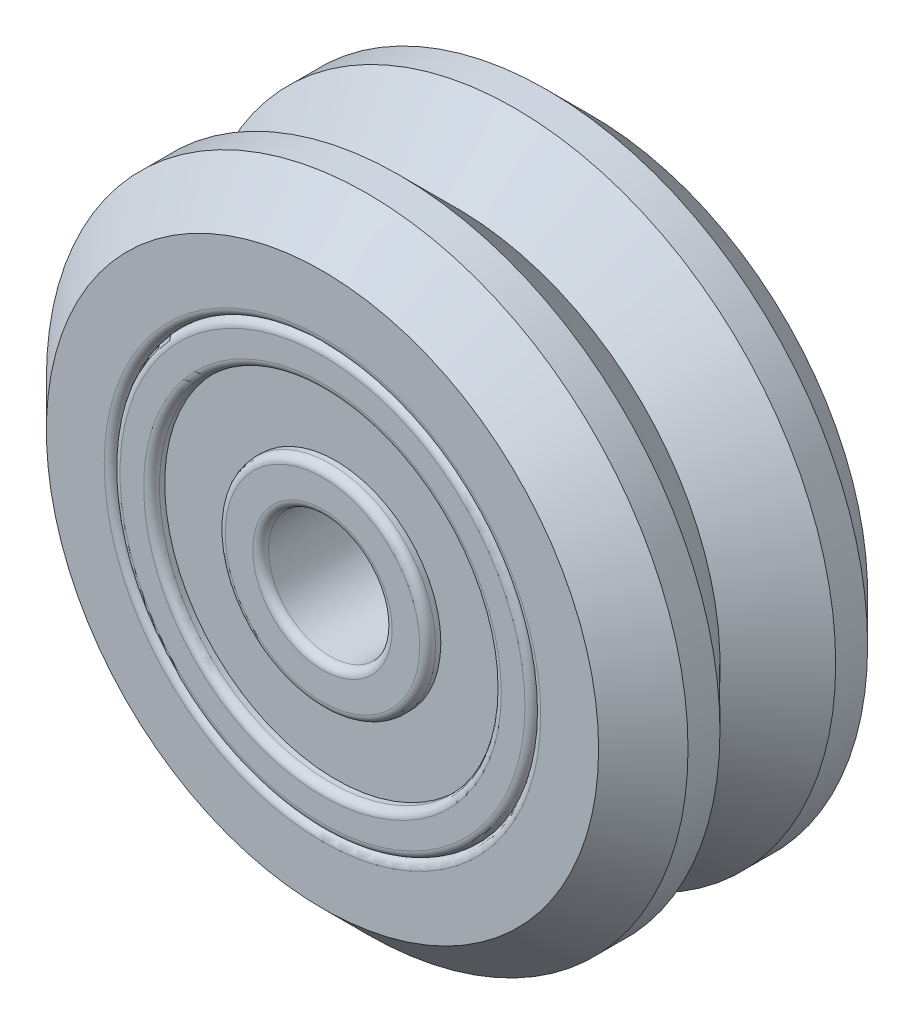
ISO-10303-21;
HEADER;
FILE_DESCRIPTION(('STEP AP214'),'2;1');
FILE_NAME('part.step','',(''),(''),'','','');
FILE_SCHEMA(('AUTOMOTIVE_DESIGN { 1 0 10303 214 1 1 1 1 }'));
ENDSEC;
DATA;
#1=APPLICATION_CONTEXT('core data for automotive mechanical design processes');
#2=APPLICATION_PROTOCOL_DEFINITION('international standard','automotive_design',2000,#1);
#3=PRODUCT_CONTEXT('',#1,'mechanical');
#4=PRODUCT('Part','Part','',(#3));
#5=PRODUCT_RELATED_PRODUCT_CATEGORY('part','',(#4));
#6=PRODUCT_DEFINITION_FORMATION('','',#4);
#7=PRODUCT_DEFINITION_CONTEXT('part definition',#1,'design');
#8=PRODUCT_DEFINITION('design','',#6,#7);
#9=PRODUCT_DEFINITION_SHAPE('','',#8);
#10=(LENGTH_UNIT() NAMED_UNIT(*) SI_UNIT(.MILLI.,.METRE.));
#11=(NAMED_UNIT(*) PLANE_ANGLE_UNIT() SI_UNIT($,.RADIAN.));
#12=(NAMED_UNIT(*) SI_UNIT($,.STERADIAN.) SOLID_ANGLE_UNIT());
#13=UNCERTAINTY_MEASURE_WITH_UNIT(LENGTH_MEASURE(1.E-05),#10,'distance_accuracy_value','');
#14=(GEOMETRIC_REPRESENTATION_CONTEXT(3) GLOBAL_UNCERTAINTY_ASSIGNED_CONTEXT((#13)) GLOBAL_UNIT_ASSIGNED_CONTEXT((#10,
#11,#12)) REPRESENTATION_CONTEXT('',''));
#15=CARTESIAN_POINT('',(0.,0.,0.));
#16=DIRECTION('',(0.,0.,1.));
#17=DIRECTION('',(1.,0.,0.));
#18=AXIS2_PLACEMENT_3D('',#15,#16,#17);
#19=CARTESIAN_POINT('',(0.,0.,0.));
#20=DIRECTION('',(0.,0.,-1.));
#21=DIRECTION('',(1.,0.,0.));
#22=AXIS2_PLACEMENT_3D('',#19,#20,#21);
#23=PLANE('',#22);
#24=CARTESIAN_POINT('',(0.,0.,0.));
#25=DIRECTION('',(0.,0.,1.));
#26=DIRECTION('',(1.,0.,0.));
#27=AXIS2_PLACEMENT_3D('',#24,#25,#26);
#28=CIRCLE('',#27,2.65);
#29=CARTESIAN_POINT('',(2.65,0.,0.));
#30=VERTEX_POINT('',#29);
#31=EDGE_CURVE('E74',#30,#30,#28,.F.);
#32=ORIENTED_EDGE('',*,*,#31,.F.);
#33=EDGE_LOOP('',(#32));
#34=FACE_BOUND('',#33,.T.);
#35=CARTESIAN_POINT('',(0.,0.,0.));
#36=DIRECTION('',(0.,0.,1.));
#37=DIRECTION('',(1.,0.,0.));
#38=AXIS2_PLACEMENT_3D('',#35,#36,#37);
#39=CIRCLE('',#38,3.7);
#40=CARTESIAN_POINT('',(3.7,0.,0.));
#41=VERTEX_POINT('',#40);
#42=EDGE_CURVE('E77',#41,#41,#39,.T.);
#43=ORIENTED_EDGE('',*,*,#42,.F.);
#44=EDGE_LOOP('',(#43));
#45=FACE_BOUND('',#44,.T.);
#46=ADVANCED_FACE('F51',(#34,#45),#23,.T.);
#47=CARTESIAN_POINT('',(0.,0.,4.615));
#48=DIRECTION('',(0.,0.,-1.));
#49=DIRECTION('',(1.,0.,0.));
#50=AXIS2_PLACEMENT_3D('',#47,#48,#49);
#51=CYLINDRICAL_SURFACE('',#50,8.);
#52=CARTESIAN_POINT('',(0.,0.,0.3));
#53=DIRECTION('',(0.,0.,1.));
#54=DIRECTION('',(1.,0.,0.));
#55=AXIS2_PLACEMENT_3D('',#52,#53,#54);
#56=CIRCLE('',#55,8.);
#57=CARTESIAN_POINT('',(8.,0.,0.3));
#58=VERTEX_POINT('',#57);
#59=EDGE_CURVE('E58',#58,#58,#56,.F.);
#60=ORIENTED_EDGE('',*,*,#59,.F.);
#61=EDGE_LOOP('',(#60));
#62=FACE_BOUND('',#61,.T.);
#63=CARTESIAN_POINT('',(0.,0.,4.615));
#64=DIRECTION('',(0.,0.,1.));
#65=DIRECTION('',(1.,0.,0.));
#66=AXIS2_PLACEMENT_3D('',#63,#64,#65);
#67=CIRCLE('',#66,8.);
#68=CARTESIAN_POINT('',(8.,0.,4.615));
#69=VERTEX_POINT('',#68);
#70=EDGE_CURVE('E83',#69,#69,#67,.T.);
#71=ORIENTED_EDGE('',*,*,#70,.F.);
#72=EDGE_LOOP('',(#71));
#73=FACE_BOUND('',#72,.T.);
#74=ADVANCED_FACE('F115',(#62,#73),#51,.T.);
#75=CARTESIAN_POINT('',(0.,0.,4.615));
#76=DIRECTION('',(0.,0.,-1.));
#77=DIRECTION('',(1.,0.,0.));
#78=AXIS2_PLACEMENT_3D('',#75,#76,#77);
#79=PLANE('',#78);
#80=CARTESIAN_POINT('',(0.,0.,4.615));
#81=DIRECTION('',(0.,0.,1.));
#82=DIRECTION('',(1.,0.,0.));
#83=AXIS2_PLACEMENT_3D('',#80,#81,#82);
#84=CIRCLE('',#83,2.35);
#85=CARTESIAN_POINT('',(2.35,0.,4.615));
#86=VERTEX_POINT('',#85);
#87=EDGE_CURVE('E86',#86,#86,#84,.T.);
#88=ORIENTED_EDGE('',*,*,#87,.F.);
#89=EDGE_LOOP('',(#88));
#90=FACE_BOUND('',#89,.T.);
#91=ORIENTED_EDGE('',*,*,#70,.T.);
#92=EDGE_LOOP('',(#91));
#93=FACE_BOUND('',#92,.T.);
#94=ADVANCED_FACE('F122',(#90,#93),#79,.F.);
#95=CARTESIAN_POINT('',(0.,0.,0.));
#96=DIRECTION('',(0.,0.,1.));
#97=DIRECTION('',(1.,0.,0.));
#98=AXIS2_PLACEMENT_3D('',#95,#96,#97);
#99=CIRCLE('',#98,7.7);
#100=CARTESIAN_POINT('',(7.7,0.,0.));
#101=VERTEX_POINT('',#100);
#102=EDGE_CURVE('E62',#101,#101,#99,.T.);
#103=ORIENTED_EDGE('',*,*,#102,.F.);
#104=EDGE_LOOP('',(#103));
#105=FACE_BOUND('',#104,.T.);
#106=CARTESIAN_POINT('',(0.,0.,0.));
#107=DIRECTION('',(0.,0.,1.));
#108=DIRECTION('',(1.,0.,0.));
#109=AXIS2_PLACEMENT_3D('',#106,#107,#108);
#110=CIRCLE('',#109,6.8);
#111=CARTESIAN_POINT('',(6.8,0.,0.));
#112=VERTEX_POINT('',#111);
#113=EDGE_CURVE('E66',#112,#112,#110,.F.);
#114=ORIENTED_EDGE('',*,*,#113,.F.);
#115=EDGE_LOOP('',(#114));
#116=FACE_BOUND('',#115,.T.);
#117=ADVANCED_FACE('F118',(#105,#116),#23,.T.);
#118=CARTESIAN_POINT('',(0.,0.,4.615));
#119=DIRECTION('',(0.,0.,-1.));
#120=DIRECTION('',(1.,0.,0.));
#121=AXIS2_PLACEMENT_3D('',#118,#119,#120);
#122=CYLINDRICAL_SURFACE('',#121,2.35);
#123=CARTESIAN_POINT('',(0.,0.,0.3));
#124=DIRECTION('',(0.,0.,1.));
#125=DIRECTION('',(1.,0.,0.));
#126=AXIS2_PLACEMENT_3D('',#123,#124,#125);
#127=CIRCLE('',#126,2.35);
#128=CARTESIAN_POINT('',(2.35,0.,0.3));
#129=VERTEX_POINT('',#128);
#130=EDGE_CURVE('E80',#129,#129,#127,.T.);
#131=ORIENTED_EDGE('',*,*,#130,.F.);
#132=EDGE_LOOP('',(#131));
#133=FACE_BOUND('',#132,.T.);
#134=ORIENTED_EDGE('',*,*,#87,.T.);
#135=EDGE_LOOP('',(#134));
#136=FACE_BOUND('',#135,.T.);
#137=ADVANCED_FACE('F129',(#133,#136),#122,.F.);
#138=CARTESIAN_POINT('',(0.,0.,0.5));
#139=DIRECTION('',(0.,0.,-1.));
#140=DIRECTION('',(1.,0.,0.));
#141=AXIS2_PLACEMENT_3D('',#138,#139,#140);
#142=CYLINDRICAL_SURFACE('',#141,6.5);
#143=CARTESIAN_POINT('',(0.,0.,0.3));
#144=DIRECTION('',(0.,0.,1.));
#145=DIRECTION('',(1.,0.,0.));
#146=AXIS2_PLACEMENT_3D('',#143,#144,#145);
#147=CIRCLE('',#146,6.5);
#148=CARTESIAN_POINT('',(6.5,0.,0.3));
#149=VERTEX_POINT('',#148);
#150=EDGE_CURVE('E12',#149,#149,#147,.T.);
#151=ORIENTED_EDGE('',*,*,#150,.F.);
#152=EDGE_LOOP('',(#151));
#153=FACE_BOUND('',#152,.T.);
#154=CARTESIAN_POINT('',(0.,0.,0.5));
#155=DIRECTION('',(0.,0.,1.));
#156=DIRECTION('',(1.,0.,0.));
#157=AXIS2_PLACEMENT_3D('',#154,#155,#156);
#158=CIRCLE('',#157,6.5);
#159=CARTESIAN_POINT('',(6.5,0.,0.5));
#160=VERTEX_POINT('',#159);
#161=EDGE_CURVE('E89',#160,#160,#158,.T.);
#162=ORIENTED_EDGE('',*,*,#161,.T.);
#163=EDGE_LOOP('',(#162));
#164=FACE_BOUND('',#163,.T.);
#165=ADVANCED_FACE('F111',(#153,#164),#142,.F.);
#166=CARTESIAN_POINT('',(0.,0.,0.5));
#167=DIRECTION('',(0.,0.,-1.));
#168=DIRECTION('',(1.,0.,0.));
#169=AXIS2_PLACEMENT_3D('',#166,#167,#168);
#170=PLANE('',#169);
#171=CARTESIAN_POINT('',(0.,0.,0.5));
#172=DIRECTION('',(0.,0.,1.));
#173=DIRECTION('',(1.,0.,0.));
#174=AXIS2_PLACEMENT_3D('',#171,#172,#173);
#175=CIRCLE('',#174,4.);
#176=CARTESIAN_POINT('',(4.,0.,0.5));
#177=VERTEX_POINT('',#176);
#178=EDGE_CURVE('E92',#177,#177,#175,.T.);
#179=ORIENTED_EDGE('',*,*,#178,.T.);
#180=EDGE_LOOP('',(#179));
#181=FACE_BOUND('',#180,.T.);
#182=ORIENTED_EDGE('',*,*,#161,.F.);
#183=EDGE_LOOP('',(#182));
#184=FACE_BOUND('',#183,.T.);
#185=ADVANCED_FACE('F96',(#181,#184),#170,.T.);
#186=CARTESIAN_POINT('',(0.,0.,0.5));
#187=DIRECTION('',(0.,0.,-1.));
#188=DIRECTION('',(1.,0.,0.));
#189=AXIS2_PLACEMENT_3D('',#186,#187,#188);
#190=CYLINDRICAL_SURFACE('',#189,4.);
#191=CARTESIAN_POINT('',(0.,0.,0.3));
#192=DIRECTION('',(0.,0.,1.));
#193=DIRECTION('',(1.,0.,0.));
#194=AXIS2_PLACEMENT_3D('',#191,#192,#193);
#195=CIRCLE('',#194,4.);
#196=CARTESIAN_POINT('',(4.,0.,0.3));
#197=VERTEX_POINT('',#196);
#198=EDGE_CURVE('E71',#197,#197,#195,.F.);
#199=ORIENTED_EDGE('',*,*,#198,.F.);
#200=EDGE_LOOP('',(#199));
#201=FACE_BOUND('',#200,.T.);
#202=ORIENTED_EDGE('',*,*,#178,.F.);
#203=EDGE_LOOP('',(#202));
#204=FACE_BOUND('',#203,.T.);
#205=ADVANCED_FACE('F99',(#201,#204),#190,.T.);
#206=CARTESIAN_POINT('',(0.,0.,0.3));
#207=DIRECTION('',(0.,0.,-1.));
#208=DIRECTION('',(1.,0.,0.));
#209=AXIS2_PLACEMENT_3D('',#206,#207,#208);
#210=TOROIDAL_SURFACE('',#209,2.65,0.3);
#211=ORIENTED_EDGE('',*,*,#31,.T.);
#212=EDGE_LOOP('',(#211));
#213=FACE_BOUND('',#212,.T.);
#214=ORIENTED_EDGE('',*,*,#130,.T.);
#215=EDGE_LOOP('',(#214));
#216=FACE_BOUND('',#215,.T.);
#217=ADVANCED_FACE('F101',(#213,#216),#210,.T.);
#218=CARTESIAN_POINT('',(0.,0.,0.3));
#219=DIRECTION('',(0.,0.,-1.));
#220=DIRECTION('',(1.,0.,0.));
#221=AXIS2_PLACEMENT_3D('',#218,#219,#220);
#222=TOROIDAL_SURFACE('',#221,3.7,0.3);
#223=ORIENTED_EDGE('',*,*,#198,.T.);
#224=EDGE_LOOP('',(#223));
#225=FACE_BOUND('',#224,.T.);
#226=ORIENTED_EDGE('',*,*,#42,.T.);
#227=EDGE_LOOP('',(#226));
#228=FACE_BOUND('',#227,.T.);
#229=ADVANCED_FACE('F108',(#225,#228),#222,.T.);
#230=CARTESIAN_POINT('',(0.,0.,0.3));
#231=DIRECTION('',(0.,0.,-1.));
#232=DIRECTION('',(1.,0.,0.));
#233=AXIS2_PLACEMENT_3D('',#230,#231,#232);
#234=TOROIDAL_SURFACE('',#233,7.7,0.3);
#235=ORIENTED_EDGE('',*,*,#59,.T.);
#236=EDGE_LOOP('',(#235));
#237=FACE_BOUND('',#236,.T.);
#238=ORIENTED_EDGE('',*,*,#102,.T.);
#239=EDGE_LOOP('',(#238));
#240=FACE_BOUND('',#239,.T.);
#241=ADVANCED_FACE('F143',(#237,#240),#234,.T.);
#242=CARTESIAN_POINT('',(0.,0.,0.3));
#243=DIRECTION('',(0.,0.,-1.));
#244=DIRECTION('',(1.,0.,0.));
#245=AXIS2_PLACEMENT_3D('',#242,#243,#244);
#246=TOROIDAL_SURFACE('',#245,6.8,0.3);
#247=ORIENTED_EDGE('',*,*,#113,.T.);
#248=EDGE_LOOP('',(#247));
#249=FACE_BOUND('',#248,.T.);
#250=ORIENTED_EDGE('',*,*,#150,.T.);
#251=EDGE_LOOP('',(#250));
#252=FACE_BOUND('',#251,.T.);
#253=ADVANCED_FACE('F53',(#249,#252),#246,.T.);
#254=CLOSED_SHELL('',(#46,#74,#94,#117,#137,#165,#185,#205,#217,#229,#241,#253));
#255=MANIFOLD_SOLID_BREP('B2',#254);
#256=CARTESIAN_POINT('',(0.,0.,10.23));
#257=DIRECTION('',(0.,0.,1.));
#258=DIRECTION('',(1.,0.,0.));
#259=AXIS2_PLACEMENT_3D('',#256,#257,#258);
#260=PLANE('',#259);
#261=CARTESIAN_POINT('',(0.,0.,10.23));
#262=DIRECTION('',(0.,0.,1.));
#263=DIRECTION('',(1.,0.,0.));
#264=AXIS2_PLACEMENT_3D('',#261,#262,#263);
#265=CIRCLE('',#264,2.65);
#266=CARTESIAN_POINT('',(2.65,0.,10.23));
#267=VERTEX_POINT('',#266);
#268=EDGE_CURVE('E286',#267,#267,#265,.F.);
#269=ORIENTED_EDGE('',*,*,#268,.T.);
#270=EDGE_LOOP('',(#269));
#271=FACE_BOUND('',#270,.T.);
#272=CARTESIAN_POINT('',(0.,0.,10.23));
#273=DIRECTION('',(0.,0.,1.));
#274=DIRECTION('',(1.,0.,0.));
#275=AXIS2_PLACEMENT_3D('',#272,#273,#274);
#276=CIRCLE('',#275,3.7);
#277=CARTESIAN_POINT('',(3.7,0.,10.23));
#278=VERTEX_POINT('',#277);
#279=EDGE_CURVE('E289',#278,#278,#276,.T.);
#280=ORIENTED_EDGE('',*,*,#279,.T.);
#281=EDGE_LOOP('',(#280));
#282=FACE_BOUND('',#281,.T.);
#283=ADVANCED_FACE('F263',(#271,#282),#260,.T.);
#284=CARTESIAN_POINT('',(0.,0.,5.615));
#285=DIRECTION('',(0.,0.,1.));
#286=DIRECTION('',(1.,0.,0.));
#287=AXIS2_PLACEMENT_3D('',#284,#285,#286);
#288=CYLINDRICAL_SURFACE('',#287,8.);
#289=CARTESIAN_POINT('',(0.,0.,9.93));
#290=DIRECTION('',(0.,0.,1.));
#291=DIRECTION('',(1.,0.,0.));
#292=AXIS2_PLACEMENT_3D('',#289,#290,#291);
#293=CIRCLE('',#292,8.);
#294=CARTESIAN_POINT('',(8.,0.,9.93));
#295=VERTEX_POINT('',#294);
#296=EDGE_CURVE('E270',#295,#295,#293,.F.);
#297=ORIENTED_EDGE('',*,*,#296,.T.);
#298=EDGE_LOOP('',(#297));
#299=FACE_BOUND('',#298,.T.);
#300=CARTESIAN_POINT('',(0.,0.,5.615));
#301=DIRECTION('',(0.,0.,1.));
#302=DIRECTION('',(1.,0.,0.));
#303=AXIS2_PLACEMENT_3D('',#300,#301,#302);
#304=CIRCLE('',#303,8.);
#305=CARTESIAN_POINT('',(8.,0.,5.615));
#306=VERTEX_POINT('',#305);
#307=EDGE_CURVE('E295',#306,#306,#304,.T.);
#308=ORIENTED_EDGE('',*,*,#307,.T.);
#309=EDGE_LOOP('',(#308));
#310=FACE_BOUND('',#309,.T.);
#311=ADVANCED_FACE('F327',(#299,#310),#288,.T.);
#312=CARTESIAN_POINT('',(0.,0.,5.615));
#313=DIRECTION('',(0.,0.,1.));
#314=DIRECTION('',(1.,0.,0.));
#315=AXIS2_PLACEMENT_3D('',#312,#313,#314);
#316=PLANE('',#315);
#317=CARTESIAN_POINT('',(0.,0.,5.615));
#318=DIRECTION('',(0.,0.,1.));
#319=DIRECTION('',(1.,0.,0.));
#320=AXIS2_PLACEMENT_3D('',#317,#318,#319);
#321=CIRCLE('',#320,2.35);
#322=CARTESIAN_POINT('',(2.35,0.,5.615));
#323=VERTEX_POINT('',#322);
#324=EDGE_CURVE('E298',#323,#323,#321,.T.);
#325=ORIENTED_EDGE('',*,*,#324,.T.);
#326=EDGE_LOOP('',(#325));
#327=FACE_BOUND('',#326,.T.);
#328=ORIENTED_EDGE('',*,*,#307,.F.);
#329=EDGE_LOOP('',(#328));
#330=FACE_BOUND('',#329,.T.);
#331=ADVANCED_FACE('F333',(#327,#330),#316,.F.);
#332=CARTESIAN_POINT('',(0.,0.,10.23));
#333=DIRECTION('',(0.,0.,1.));
#334=DIRECTION('',(1.,0.,0.));
#335=AXIS2_PLACEMENT_3D('',#332,#333,#334);
#336=CIRCLE('',#335,7.7);
#337=CARTESIAN_POINT('',(7.7,0.,10.23));
#338=VERTEX_POINT('',#337);
#339=EDGE_CURVE('E274',#338,#338,#336,.T.);
#340=ORIENTED_EDGE('',*,*,#339,.T.);
#341=EDGE_LOOP('',(#340));
#342=FACE_BOUND('',#341,.T.);
#343=CARTESIAN_POINT('',(0.,0.,10.23));
#344=DIRECTION('',(0.,0.,1.));
#345=DIRECTION('',(1.,0.,0.));
#346=AXIS2_PLACEMENT_3D('',#343,#344,#345);
#347=CIRCLE('',#346,6.8);
#348=CARTESIAN_POINT('',(6.8,0.,10.23));
#349=VERTEX_POINT('',#348);
#350=EDGE_CURVE('E278',#349,#349,#347,.F.);
#351=ORIENTED_EDGE('',*,*,#350,.T.);
#352=EDGE_LOOP('',(#351));
#353=FACE_BOUND('',#352,.T.);
#354=ADVANCED_FACE('F323',(#342,#353),#260,.T.);
#355=CARTESIAN_POINT('',(0.,0.,5.615));
#356=DIRECTION('',(0.,0.,1.));
#357=DIRECTION('',(1.,0.,0.));
#358=AXIS2_PLACEMENT_3D('',#355,#356,#357);
#359=CYLINDRICAL_SURFACE('',#358,2.35);
#360=CARTESIAN_POINT('',(0.,0.,9.93));
#361=DIRECTION('',(0.,0.,1.));
#362=DIRECTION('',(1.,0.,0.));
#363=AXIS2_PLACEMENT_3D('',#360,#361,#362);
#364=CIRCLE('',#363,2.35);
#365=CARTESIAN_POINT('',(2.35,0.,9.93));
#366=VERTEX_POINT('',#365);
#367=EDGE_CURVE('E292',#366,#366,#364,.T.);
#368=ORIENTED_EDGE('',*,*,#367,.T.);
#369=EDGE_LOOP('',(#368));
#370=FACE_BOUND('',#369,.T.);
#371=ORIENTED_EDGE('',*,*,#324,.F.);
#372=EDGE_LOOP('',(#371));
#373=FACE_BOUND('',#372,.T.);
#374=ADVANCED_FACE('F318',(#370,#373),#359,.F.);
#375=CARTESIAN_POINT('',(0.,0.,9.73));
#376=DIRECTION('',(0.,0.,1.));
#377=DIRECTION('',(1.,0.,0.));
#378=AXIS2_PLACEMENT_3D('',#375,#376,#377);
#379=CYLINDRICAL_SURFACE('',#378,6.5);
#380=CARTESIAN_POINT('',(0.,0.,9.93));
#381=DIRECTION('',(0.,0.,1.));
#382=DIRECTION('',(1.,0.,0.));
#383=AXIS2_PLACEMENT_3D('',#380,#381,#382);
#384=CIRCLE('',#383,6.5);
#385=CARTESIAN_POINT('',(6.5,0.,9.93));
#386=VERTEX_POINT('',#385);
#387=EDGE_CURVE('E50',#386,#386,#384,.T.);
#388=ORIENTED_EDGE('',*,*,#387,.T.);
#389=EDGE_LOOP('',(#388));
#390=FACE_BOUND('',#389,.T.);
#391=CARTESIAN_POINT('',(0.,0.,9.73));
#392=DIRECTION('',(0.,0.,1.));
#393=DIRECTION('',(1.,0.,0.));
#394=AXIS2_PLACEMENT_3D('',#391,#392,#393);
#395=CIRCLE('',#394,6.5);
#396=CARTESIAN_POINT('',(6.5,0.,9.73));
#397=VERTEX_POINT('',#396);
#398=EDGE_CURVE('E301',#397,#397,#395,.T.);
#399=ORIENTED_EDGE('',*,*,#398,.F.);
#400=EDGE_LOOP('',(#399));
#401=FACE_BOUND('',#400,.T.);
#402=ADVANCED_FACE('F313',(#390,#401),#379,.F.);
#403=CARTESIAN_POINT('',(0.,0.,9.73));
#404=DIRECTION('',(0.,0.,1.));
#405=DIRECTION('',(1.,0.,0.));
#406=AXIS2_PLACEMENT_3D('',#403,#404,#405);
#407=PLANE('',#406);
#408=CARTESIAN_POINT('',(0.,0.,9.73));
#409=DIRECTION('',(0.,0.,1.));
#410=DIRECTION('',(1.,0.,0.));
#411=AXIS2_PLACEMENT_3D('',#408,#409,#410);
#412=CIRCLE('',#411,4.);
#413=CARTESIAN_POINT('',(4.,0.,9.73));
#414=VERTEX_POINT('',#413);
#415=EDGE_CURVE('E304',#414,#414,#412,.T.);
#416=ORIENTED_EDGE('',*,*,#415,.F.);
#417=EDGE_LOOP('',(#416));
#418=FACE_BOUND('',#417,.T.);
#419=ORIENTED_EDGE('',*,*,#398,.T.);
#420=EDGE_LOOP('',(#419));
#421=FACE_BOUND('',#420,.T.);
#422=ADVANCED_FACE('F310',(#418,#421),#407,.T.);
#423=CARTESIAN_POINT('',(0.,0.,9.73));
#424=DIRECTION('',(0.,0.,1.));
#425=DIRECTION('',(1.,0.,0.));
#426=AXIS2_PLACEMENT_3D('',#423,#424,#425);
#427=CYLINDRICAL_SURFACE('',#426,4.);
#428=CARTESIAN_POINT('',(0.,0.,9.93));
#429=DIRECTION('',(0.,0.,1.));
#430=DIRECTION('',(1.,0.,0.));
#431=AXIS2_PLACEMENT_3D('',#428,#429,#430);
#432=CIRCLE('',#431,4.);
#433=CARTESIAN_POINT('',(4.,0.,9.93));
#434=VERTEX_POINT('',#433);
#435=EDGE_CURVE('E283',#434,#434,#432,.F.);
#436=ORIENTED_EDGE('',*,*,#435,.T.);
#437=EDGE_LOOP('',(#436));
#438=FACE_BOUND('',#437,.T.);
#439=ORIENTED_EDGE('',*,*,#415,.T.);
#440=EDGE_LOOP('',(#439));
#441=FACE_BOUND('',#440,.T.);
#442=ADVANCED_FACE('F308',(#438,#441),#427,.T.);
#443=CARTESIAN_POINT('',(0.,0.,9.93));
#444=DIRECTION('',(0.,0.,1.));
#445=DIRECTION('',(1.,0.,0.));
#446=AXIS2_PLACEMENT_3D('',#443,#444,#445);
#447=TOROIDAL_SURFACE('',#446,2.65,0.3);
#448=ORIENTED_EDGE('',*,*,#268,.F.);
#449=EDGE_LOOP('',(#448));
#450=FACE_BOUND('',#449,.T.);
#451=ORIENTED_EDGE('',*,*,#367,.F.);
#452=EDGE_LOOP('',(#451));
#453=FACE_BOUND('',#452,.T.);
#454=ADVANCED_FACE('F358',(#450,#453),#447,.T.);
#455=CARTESIAN_POINT('',(0.,0.,9.93));
#456=DIRECTION('',(0.,0.,1.));
#457=DIRECTION('',(1.,0.,0.));
#458=AXIS2_PLACEMENT_3D('',#455,#456,#457);
#459=TOROIDAL_SURFACE('',#458,3.7,0.3);
#460=ORIENTED_EDGE('',*,*,#435,.F.);
#461=EDGE_LOOP('',(#460));
#462=FACE_BOUND('',#461,.T.);
#463=ORIENTED_EDGE('',*,*,#279,.F.);
#464=EDGE_LOOP('',(#463));
#465=FACE_BOUND('',#464,.T.);
#466=ADVANCED_FACE('F353',(#462,#465),#459,.T.);
#467=CARTESIAN_POINT('',(0.,0.,9.93));
#468=DIRECTION('',(0.,0.,1.));
#469=DIRECTION('',(1.,0.,0.));
#470=AXIS2_PLACEMENT_3D('',#467,#468,#469);
#471=TOROIDAL_SURFACE('',#470,7.7,0.3);
#472=ORIENTED_EDGE('',*,*,#296,.F.);
#473=EDGE_LOOP('',(#472));
#474=FACE_BOUND('',#473,.T.);
#475=ORIENTED_EDGE('',*,*,#339,.F.);
#476=EDGE_LOOP('',(#475));
#477=FACE_BOUND('',#476,.T.);
#478=ADVANCED_FACE('F349',(#474,#477),#471,.T.);
#479=CARTESIAN_POINT('',(0.,0.,9.93));
#480=DIRECTION('',(0.,0.,1.));
#481=DIRECTION('',(1.,0.,0.));
#482=AXIS2_PLACEMENT_3D('',#479,#480,#481);
#483=TOROIDAL_SURFACE('',#482,6.8,0.3);
#484=ORIENTED_EDGE('',*,*,#350,.F.);
#485=EDGE_LOOP('',(#484));
#486=FACE_BOUND('',#485,.T.);
#487=ORIENTED_EDGE('',*,*,#387,.F.);
#488=EDGE_LOOP('',(#487));
#489=FACE_BOUND('',#488,.T.);
#490=ADVANCED_FACE('F265',(#486,#489),#483,.T.);
#491=CLOSED_SHELL('',(#283,#311,#331,#354,#374,#402,#422,#442,#454,#466,#478,#490));
#492=MANIFOLD_SOLID_BREP('B7',#491);
#493=CARTESIAN_POINT('',(0.,0.,10.23));
#494=DIRECTION('',(0.,0.,-1.));
#495=DIRECTION('',(-1.,0.,0.));
#496=AXIS2_PLACEMENT_3D('',#493,#494,#495);
#497=CYLINDRICAL_SURFACE('',#496,12.2);
#498=CARTESIAN_POINT('',(0.,0.,8.53000000000001));
#499=DIRECTION('',(0.,0.,-1.));
#500=DIRECTION('',(-1.,0.,0.));
#501=AXIS2_PLACEMENT_3D('',#498,#499,#500);
#502=CIRCLE('',#501,12.2);
#503=CARTESIAN_POINT('',(-12.2,0.,8.53000000000001));
#504=VERTEX_POINT('',#503);
#505=EDGE_CURVE('E482',#504,#504,#502,.F.);
#506=ORIENTED_EDGE('',*,*,#505,.F.);
#507=EDGE_LOOP('',(#506));
#508=FACE_BOUND('',#507,.T.);
#509=CARTESIAN_POINT('',(0.,0.,7.31499999999999));
#510=DIRECTION('',(0.,0.,1.));
#511=DIRECTION('',(1.,0.,0.));
#512=AXIS2_PLACEMENT_3D('',#509,#510,#511);
#513=CIRCLE('',#512,12.2);
#514=CARTESIAN_POINT('',(12.2,0.,7.31499999999999));
#515=VERTEX_POINT('',#514);
#516=EDGE_CURVE('E483',#515,#515,#513,.F.);
#517=ORIENTED_EDGE('',*,*,#516,.F.);
#518=EDGE_LOOP('',(#517));
#519=FACE_BOUND('',#518,.T.);
#520=ADVANCED_FACE('F462',(#508,#519),#497,.T.);
#521=CARTESIAN_POINT('',(0.,0.,10.23));
#522=DIRECTION('',(0.,0.,-1.));
#523=DIRECTION('',(-1.,0.,0.));
#524=AXIS2_PLACEMENT_3D('',#521,#522,#523);
#525=CYLINDRICAL_SURFACE('',#524,7.);
#526=CARTESIAN_POINT('',(0.,0.,5.615));
#527=DIRECTION('',(0.,0.,1.));
#528=DIRECTION('',(1.,0.,0.));
#529=AXIS2_PLACEMENT_3D('',#526,#527,#528);
#530=CIRCLE('',#529,7.);
#531=CARTESIAN_POINT('',(7.,0.,5.615));
#532=VERTEX_POINT('',#531);
#533=EDGE_CURVE('E495',#532,#532,#530,.T.);
#534=ORIENTED_EDGE('',*,*,#533,.T.);
#535=EDGE_LOOP('',(#534));
#536=FACE_BOUND('',#535,.T.);
#537=CARTESIAN_POINT('',(0.,0.,4.615));
#538=DIRECTION('',(0.,0.,-1.));
#539=DIRECTION('',(-1.,0.,0.));
#540=AXIS2_PLACEMENT_3D('',#537,#538,#539);
#541=CIRCLE('',#540,7.);
#542=CARTESIAN_POINT('',(-7.,0.,4.615));
#543=VERTEX_POINT('',#542);
#544=EDGE_CURVE('E491',#543,#543,#541,.T.);
#545=ORIENTED_EDGE('',*,*,#544,.T.);
#546=EDGE_LOOP('',(#545));
#547=FACE_BOUND('',#546,.T.);
#548=ADVANCED_FACE('F527',(#536,#547),#525,.F.);
#549=CARTESIAN_POINT('',(0.,0.,2.91500000000001));
#550=DIRECTION('',(0.,0.,-1.));
#551=DIRECTION('',(-1.,0.,0.));
#552=AXIS2_PLACEMENT_3D('',#549,#550,#551);
#553=CIRCLE('',#552,12.2);
#554=CARTESIAN_POINT('',(-12.2,0.,2.91500000000001));
#555=VERTEX_POINT('',#554);
#556=EDGE_CURVE('E487',#555,#555,#553,.T.);
#557=ORIENTED_EDGE('',*,*,#556,.T.);
#558=EDGE_LOOP('',(#557));
#559=FACE_BOUND('',#558,.T.);
#560=CARTESIAN_POINT('',(0.,0.,1.69999999999999));
#561=DIRECTION('',(0.,0.,1.));
#562=DIRECTION('',(1.,0.,0.));
#563=AXIS2_PLACEMENT_3D('',#560,#561,#562);
#564=CIRCLE('',#563,12.2);
#565=CARTESIAN_POINT('',(12.2,0.,1.69999999999999));
#566=VERTEX_POINT('',#565);
#567=EDGE_CURVE('E504',#566,#566,#564,.F.);
#568=ORIENTED_EDGE('',*,*,#567,.F.);
#569=EDGE_LOOP('',(#568));
#570=FACE_BOUND('',#569,.T.);
#571=ADVANCED_FACE('F530',(#559,#570),#497,.T.);
#572=CARTESIAN_POINT('',(0.,0.,0.));
#573=DIRECTION('',(0.,0.,1.));
#574=DIRECTION('',(1.,0.,0.));
#575=AXIS2_PLACEMENT_3D('',#572,#573,#574);
#576=PLANE('',#575);
#577=CARTESIAN_POINT('',(0.,0.,0.));
#578=DIRECTION('',(0.,0.,1.));
#579=DIRECTION('',(1.,0.,0.));
#580=AXIS2_PLACEMENT_3D('',#577,#578,#579);
#581=CIRCLE('',#580,8.3);
#582=CARTESIAN_POINT('',(8.3,0.,0.));
#583=VERTEX_POINT('',#582);
#584=EDGE_CURVE('E262',#583,#583,#581,.T.);
#585=ORIENTED_EDGE('',*,*,#584,.T.);
#586=EDGE_LOOP('',(#585));
#587=FACE_BOUND('',#586,.T.);
#588=CARTESIAN_POINT('',(0.,0.,0.));
#589=DIRECTION('',(0.,0.,-1.));
#590=DIRECTION('',(-1.,0.,0.));
#591=AXIS2_PLACEMENT_3D('',#588,#589,#590);
#592=CIRCLE('',#591,10.5);
#593=CARTESIAN_POINT('',(-10.5,0.,0.));
#594=VERTEX_POINT('',#593);
#595=EDGE_CURVE('E498',#594,#594,#592,.T.);
#596=ORIENTED_EDGE('',*,*,#595,.T.);
#597=EDGE_LOOP('',(#596));
#598=FACE_BOUND('',#597,.T.);
#599=ADVANCED_FACE('F539',(#587,#598),#576,.F.);
#600=CARTESIAN_POINT('',(0.,0.,10.23));
#601=DIRECTION('',(0.,0.,1.));
#602=DIRECTION('',(1.,0.,0.));
#603=AXIS2_PLACEMENT_3D('',#600,#601,#602);
#604=PLANE('',#603);
#605=CARTESIAN_POINT('',(0.,0.,10.23));
#606=DIRECTION('',(0.,0.,1.));
#607=DIRECTION('',(1.,0.,0.));
#608=AXIS2_PLACEMENT_3D('',#605,#606,#607);
#609=CIRCLE('',#608,8.3);
#610=CARTESIAN_POINT('',(8.3,0.,10.23));
#611=VERTEX_POINT('',#610);
#612=EDGE_CURVE('E473',#611,#611,#609,.F.);
#613=ORIENTED_EDGE('',*,*,#612,.T.);
#614=EDGE_LOOP('',(#613));
#615=FACE_BOUND('',#614,.T.);
#616=CARTESIAN_POINT('',(0.,0.,10.23));
#617=DIRECTION('',(0.,0.,1.));
#618=DIRECTION('',(1.,0.,0.));
#619=AXIS2_PLACEMENT_3D('',#616,#617,#618);
#620=CIRCLE('',#619,10.5);
#621=CARTESIAN_POINT('',(10.5,0.,10.23));
#622=VERTEX_POINT('',#621);
#623=EDGE_CURVE('E501',#622,#622,#620,.T.);
#624=ORIENTED_EDGE('',*,*,#623,.T.);
#625=EDGE_LOOP('',(#624));
#626=FACE_BOUND('',#625,.T.);
#627=ADVANCED_FACE('F544',(#615,#626),#604,.T.);
#628=CARTESIAN_POINT('',(0.,0.,10.23));
#629=DIRECTION('',(0.,0.,-1.));
#630=DIRECTION('',(1.,0.,0.));
#631=AXIS2_PLACEMENT_3D('',#628,#629,#630);
#632=CONICAL_SURFACE('',#631,10.5,0.78539816339745);
#633=ORIENTED_EDGE('',*,*,#623,.F.);
#634=EDGE_LOOP('',(#633));
#635=FACE_BOUND('',#634,.T.);
#636=ORIENTED_EDGE('',*,*,#505,.T.);
#637=EDGE_LOOP('',(#636));
#638=FACE_BOUND('',#637,.T.);
#639=ADVANCED_FACE('F552',(#635,#638),#632,.T.);
#640=CARTESIAN_POINT('',(0.,0.,0.));
#641=DIRECTION('',(0.,0.,1.));
#642=DIRECTION('',(-1.,0.,0.));
#643=AXIS2_PLACEMENT_3D('',#640,#641,#642);
#644=CONICAL_SURFACE('',#643,10.5,0.78539816339745);
#645=ORIENTED_EDGE('',*,*,#595,.F.);
#646=EDGE_LOOP('',(#645));
#647=FACE_BOUND('',#646,.T.);
#648=ORIENTED_EDGE('',*,*,#567,.T.);
#649=EDGE_LOOP('',(#648));
#650=FACE_BOUND('',#649,.T.);
#651=ADVANCED_FACE('F549',(#647,#650),#644,.T.);
#652=CARTESIAN_POINT('',(0.,0.,5.615));
#653=DIRECTION('',(0.,0.,1.));
#654=DIRECTION('',(1.,0.,0.));
#655=AXIS2_PLACEMENT_3D('',#652,#653,#654);
#656=CYLINDRICAL_SURFACE('',#655,8.);
#657=CARTESIAN_POINT('',(0.,0.,9.93));
#658=DIRECTION('',(0.,0.,1.));
#659=DIRECTION('',(1.,0.,0.));
#660=AXIS2_PLACEMENT_3D('',#657,#658,#659);
#661=CIRCLE('',#660,8.);
#662=CARTESIAN_POINT('',(8.,0.,9.93));
#663=VERTEX_POINT('',#662);
#664=EDGE_CURVE('E477',#663,#663,#661,.T.);
#665=ORIENTED_EDGE('',*,*,#664,.T.);
#666=EDGE_LOOP('',(#665));
#667=FACE_BOUND('',#666,.T.);
#668=CARTESIAN_POINT('',(0.,0.,5.615));
#669=DIRECTION('',(0.,0.,1.));
#670=DIRECTION('',(1.,0.,0.));
#671=AXIS2_PLACEMENT_3D('',#668,#669,#670);
#672=CIRCLE('',#671,8.);
#673=CARTESIAN_POINT('',(8.,0.,5.615));
#674=VERTEX_POINT('',#673);
#675=EDGE_CURVE('E494',#674,#674,#672,.T.);
#676=ORIENTED_EDGE('',*,*,#675,.F.);
#677=EDGE_LOOP('',(#676));
#678=FACE_BOUND('',#677,.T.);
#679=ADVANCED_FACE('F551',(#667,#678),#656,.F.);
#680=CARTESIAN_POINT('',(0.,0.,5.615));
#681=DIRECTION('',(0.,0.,1.));
#682=DIRECTION('',(1.,0.,0.));
#683=AXIS2_PLACEMENT_3D('',#680,#681,#682);
#684=PLANE('',#683);
#685=ORIENTED_EDGE('',*,*,#533,.F.);
#686=EDGE_LOOP('',(#685));
#687=FACE_BOUND('',#686,.T.);
#688=ORIENTED_EDGE('',*,*,#675,.T.);
#689=EDGE_LOOP('',(#688));
#690=FACE_BOUND('',#689,.T.);
#691=ADVANCED_FACE('F559',(#687,#690),#684,.T.);
#692=CARTESIAN_POINT('',(0.,0.,4.615));
#693=DIRECTION('',(0.,0.,-1.));
#694=DIRECTION('',(-1.,0.,0.));
#695=AXIS2_PLACEMENT_3D('',#692,#693,#694);
#696=CYLINDRICAL_SURFACE('',#695,8.);
#697=CARTESIAN_POINT('',(0.,0.,0.3));
#698=DIRECTION('',(0.,0.,1.));
#699=DIRECTION('',(1.,0.,0.));
#700=AXIS2_PLACEMENT_3D('',#697,#698,#699);
#701=CIRCLE('',#700,8.);
#702=CARTESIAN_POINT('',(8.,0.,0.3));
#703=VERTEX_POINT('',#702);
#704=EDGE_CURVE('E469',#703,#703,#701,.F.);
#705=ORIENTED_EDGE('',*,*,#704,.T.);
#706=EDGE_LOOP('',(#705));
#707=FACE_BOUND('',#706,.T.);
#708=CARTESIAN_POINT('',(0.,0.,4.615));
#709=DIRECTION('',(0.,0.,-1.));
#710=DIRECTION('',(-1.,0.,0.));
#711=AXIS2_PLACEMENT_3D('',#708,#709,#710);
#712=CIRCLE('',#711,8.);
#713=CARTESIAN_POINT('',(-8.,0.,4.615));
#714=VERTEX_POINT('',#713);
#715=EDGE_CURVE('E486',#714,#714,#712,.T.);
#716=ORIENTED_EDGE('',*,*,#715,.F.);
#717=EDGE_LOOP('',(#716));
#718=FACE_BOUND('',#717,.T.);
#719=ADVANCED_FACE('F584',(#707,#718),#696,.F.);
#720=CARTESIAN_POINT('',(0.,0.,4.615));
#721=DIRECTION('',(0.,0.,-1.));
#722=DIRECTION('',(-1.,0.,0.));
#723=AXIS2_PLACEMENT_3D('',#720,#721,#722);
#724=PLANE('',#723);
#725=ORIENTED_EDGE('',*,*,#544,.F.);
#726=EDGE_LOOP('',(#725));
#727=FACE_BOUND('',#726,.T.);
#728=ORIENTED_EDGE('',*,*,#715,.T.);
#729=EDGE_LOOP('',(#728));
#730=FACE_BOUND('',#729,.T.);
#731=ADVANCED_FACE('F522',(#727,#730),#724,.T.);
#732=CARTESIAN_POINT('',(0.,0.,5.115));
#733=DIRECTION('',(0.,0.,1.));
#734=DIRECTION('',(-1.,0.,0.));
#735=AXIS2_PLACEMENT_3D('',#732,#733,#734);
#736=CONICAL_SURFACE('',#735,10.,0.78539816339745);
#737=CARTESIAN_POINT('',(0.,0.,5.115));
#738=DIRECTION('',(0.,0.,-1.));
#739=DIRECTION('',(-1.,0.,0.));
#740=AXIS2_PLACEMENT_3D('',#737,#738,#739);
#741=CIRCLE('',#740,10.);
#742=CARTESIAN_POINT('',(-10.,0.,5.115));
#743=VERTEX_POINT('',#742);
#744=EDGE_CURVE('E490',#743,#743,#741,.T.);
#745=ORIENTED_EDGE('',*,*,#744,.F.);
#746=EDGE_LOOP('',(#745));
#747=FACE_BOUND('',#746,.T.);
#748=ORIENTED_EDGE('',*,*,#516,.T.);
#749=EDGE_LOOP('',(#748));
#750=FACE_BOUND('',#749,.T.);
#751=ADVANCED_FACE('F519',(#747,#750),#736,.T.);
#752=CARTESIAN_POINT('',(0.,0.,5.115));
#753=DIRECTION('',(0.,0.,-1.));
#754=DIRECTION('',(-1.,0.,0.));
#755=AXIS2_PLACEMENT_3D('',#752,#753,#754);
#756=CONICAL_SURFACE('',#755,10.,0.78539816339745);
#757=ORIENTED_EDGE('',*,*,#744,.T.);
#758=EDGE_LOOP('',(#757));
#759=FACE_BOUND('',#758,.T.);
#760=ORIENTED_EDGE('',*,*,#556,.F.);
#761=EDGE_LOOP('',(#760));
#762=FACE_BOUND('',#761,.T.);
#763=ADVANCED_FACE('F516',(#759,#762),#756,.T.);
#764=CARTESIAN_POINT('',(0.,0.,9.93));
#765=DIRECTION('',(0.,0.,1.));
#766=DIRECTION('',(1.,0.,0.));
#767=AXIS2_PLACEMENT_3D('',#764,#765,#766);
#768=TOROIDAL_SURFACE('',#767,8.3,0.3);
#769=ORIENTED_EDGE('',*,*,#612,.F.);
#770=EDGE_LOOP('',(#769));
#771=FACE_BOUND('',#770,.T.);
#772=ORIENTED_EDGE('',*,*,#664,.F.);
#773=EDGE_LOOP('',(#772));
#774=FACE_BOUND('',#773,.T.);
#775=ADVANCED_FACE('F576',(#771,#774),#768,.T.);
#776=CARTESIAN_POINT('',(0.,0.,0.3));
#777=DIRECTION('',(0.,0.,1.));
#778=DIRECTION('',(1.,0.,0.));
#779=AXIS2_PLACEMENT_3D('',#776,#777,#778);
#780=TOROIDAL_SURFACE('',#779,8.3,0.3);
#781=ORIENTED_EDGE('',*,*,#584,.F.);
#782=EDGE_LOOP('',(#781));
#783=FACE_BOUND('',#782,.T.);
#784=ORIENTED_EDGE('',*,*,#704,.F.);
#785=EDGE_LOOP('',(#784));
#786=FACE_BOUND('',#785,.T.);
#787=ADVANCED_FACE('F464',(#783,#786),#780,.T.);
#788=CLOSED_SHELL('',(#520,#548,#571,#599,#627,#639,#651,#679,#691,#719,#731,#751,#763,#775,#787));
#789=MANIFOLD_SOLID_BREP('B45',#788);
#790=ADVANCED_BREP_SHAPE_REPRESENTATION('',(#18,#255,#492,#789),#14);
#791=SHAPE_DEFINITION_REPRESENTATION(#9,#790);
ENDSEC;
END-ISO-10303-21;
